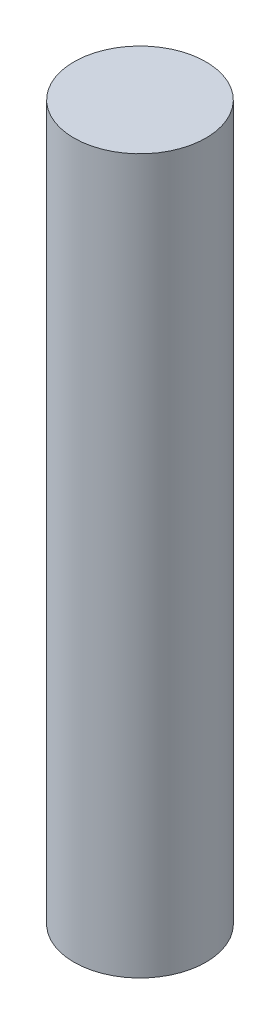
ISO-10303-21;
HEADER;
FILE_DESCRIPTION(('STEP AP214'),'2;1');
FILE_NAME('part.step','',(''),(''),'','','');
FILE_SCHEMA(('AUTOMOTIVE_DESIGN { 1 0 10303 214 1 1 1 1 }'));
ENDSEC;
DATA;
#1=APPLICATION_CONTEXT('core data for automotive mechanical design processes');
#2=APPLICATION_PROTOCOL_DEFINITION('international standard','automotive_design',2000,#1);
#3=PRODUCT_CONTEXT('',#1,'mechanical');
#4=PRODUCT('Part','Part','',(#3));
#5=PRODUCT_RELATED_PRODUCT_CATEGORY('part','',(#4));
#6=PRODUCT_DEFINITION_FORMATION('','',#4);
#7=PRODUCT_DEFINITION_CONTEXT('part definition',#1,'design');
#8=PRODUCT_DEFINITION('design','',#6,#7);
#9=PRODUCT_DEFINITION_SHAPE('','',#8);
#10=(LENGTH_UNIT() NAMED_UNIT(*) SI_UNIT(.MILLI.,.METRE.));
#11=(NAMED_UNIT(*) PLANE_ANGLE_UNIT() SI_UNIT($,.RADIAN.));
#12=(NAMED_UNIT(*) SI_UNIT($,.STERADIAN.) SOLID_ANGLE_UNIT());
#13=UNCERTAINTY_MEASURE_WITH_UNIT(LENGTH_MEASURE(1.E-05),#10,'distance_accuracy_value','');
#14=(GEOMETRIC_REPRESENTATION_CONTEXT(3) GLOBAL_UNCERTAINTY_ASSIGNED_CONTEXT((#13)) GLOBAL_UNIT_ASSIGNED_CONTEXT((#10,
#11,#12)) REPRESENTATION_CONTEXT('',''));
#15=CARTESIAN_POINT('',(0.,0.,0.));
#16=DIRECTION('',(0.,0.,1.));
#17=DIRECTION('',(1.,0.,0.));
#18=AXIS2_PLACEMENT_3D('',#15,#16,#17);
#19=CARTESIAN_POINT('',(0.,10.,0.));
#20=DIRECTION('',(0.,-1.,0.));
#21=DIRECTION('',(0.,0.,-1.));
#22=AXIS2_PLACEMENT_3D('',#19,#20,#21);
#23=CYLINDRICAL_SURFACE('',#22,0.925);
#24=CARTESIAN_POINT('',(0.,10.,0.));
#25=DIRECTION('',(0.,1.,0.));
#26=DIRECTION('',(0.,0.,1.));
#27=AXIS2_PLACEMENT_3D('',#24,#25,#26);
#28=CIRCLE('',#27,0.925);
#29=CARTESIAN_POINT('',(0.,10.,0.925));
#30=VERTEX_POINT('',#29);
#31=EDGE_CURVE('E10',#30,#30,#28,.T.);
#32=ORIENTED_EDGE('',*,*,#31,.F.);
#33=EDGE_LOOP('',(#32));
#34=FACE_BOUND('',#33,.T.);
#35=CARTESIAN_POINT('',(0.,0.,0.));
#36=DIRECTION('',(0.,1.,0.));
#37=DIRECTION('',(0.,0.,1.));
#38=AXIS2_PLACEMENT_3D('',#35,#36,#37);
#39=CIRCLE('',#38,0.925);
#40=CARTESIAN_POINT('',(0.,0.,0.925));
#41=VERTEX_POINT('',#40);
#42=EDGE_CURVE('E36',#41,#41,#39,.T.);
#43=ORIENTED_EDGE('',*,*,#42,.T.);
#44=EDGE_LOOP('',(#43));
#45=FACE_BOUND('',#44,.T.);
#46=ADVANCED_FACE('F33',(#34,#45),#23,.T.);
#47=CARTESIAN_POINT('',(0.,10.,0.));
#48=DIRECTION('',(0.,1.,0.));
#49=DIRECTION('',(0.,0.,1.));
#50=AXIS2_PLACEMENT_3D('',#47,#48,#49);
#51=PLANE('',#50);
#52=ORIENTED_EDGE('',*,*,#31,.T.);
#53=EDGE_LOOP('',(#52));
#54=FACE_BOUND('',#53,.T.);
#55=ADVANCED_FACE('F48',(#54),#51,.T.);
#56=CARTESIAN_POINT('',(0.,0.,0.));
#57=DIRECTION('',(0.,1.,0.));
#58=DIRECTION('',(0.,0.,1.));
#59=AXIS2_PLACEMENT_3D('',#56,#57,#58);
#60=PLANE('',#59);
#61=ORIENTED_EDGE('',*,*,#42,.F.);
#62=EDGE_LOOP('',(#61));
#63=FACE_BOUND('',#62,.T.);
#64=ADVANCED_FACE('F46',(#63),#60,.F.);
#65=CLOSED_SHELL('',(#46,#55,#64));
#66=MANIFOLD_SOLID_BREP('B2',#65);
#67=ADVANCED_BREP_SHAPE_REPRESENTATION('',(#18,#66),#14);
#68=SHAPE_DEFINITION_REPRESENTATION(#9,#67);
ENDSEC;
END-ISO-10303-21;
